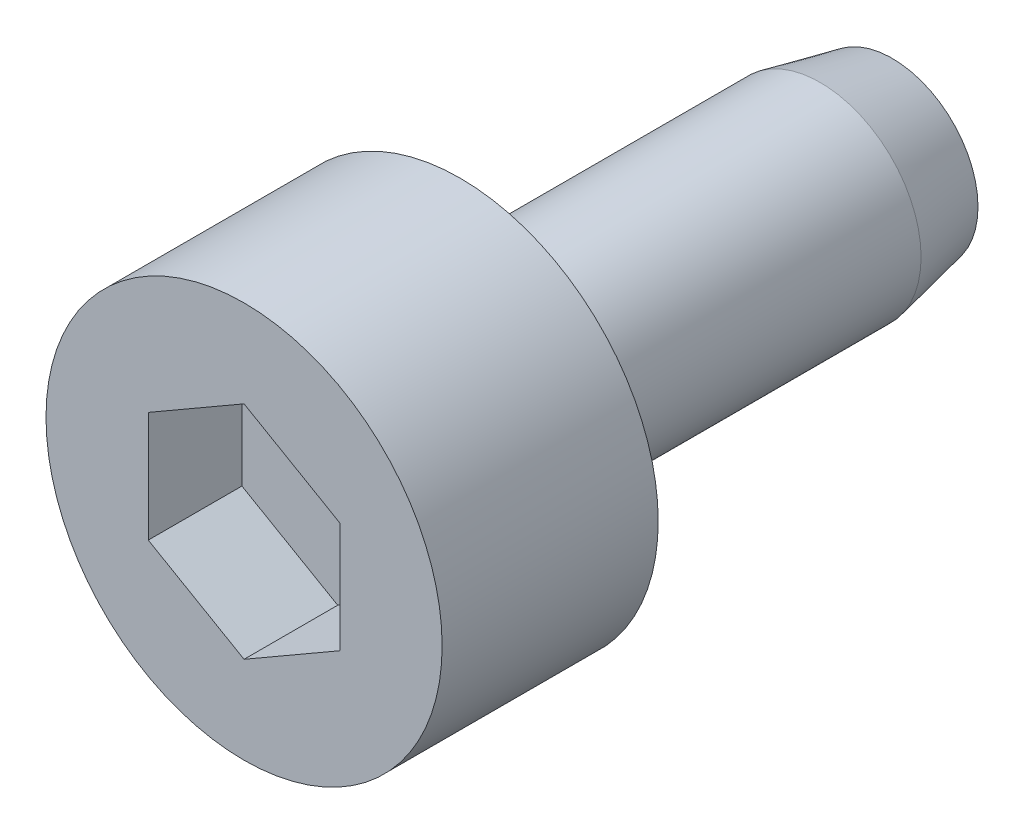
ISO-10303-21;
HEADER;
FILE_DESCRIPTION(('STEP AP214'),'2;1');
FILE_NAME('part.step','',(''),(''),'','','');
FILE_SCHEMA(('AUTOMOTIVE_DESIGN { 1 0 10303 214 1 1 1 1 }'));
ENDSEC;
DATA;
#1=APPLICATION_CONTEXT('core data for automotive mechanical design processes');
#2=APPLICATION_PROTOCOL_DEFINITION('international standard','automotive_design',2000,#1);
#3=PRODUCT_CONTEXT('',#1,'mechanical');
#4=PRODUCT('Part','Part','',(#3));
#5=PRODUCT_RELATED_PRODUCT_CATEGORY('part','',(#4));
#6=PRODUCT_DEFINITION_FORMATION('','',#4);
#7=PRODUCT_DEFINITION_CONTEXT('part definition',#1,'design');
#8=PRODUCT_DEFINITION('design','',#6,#7);
#9=PRODUCT_DEFINITION_SHAPE('','',#8);
#10=(LENGTH_UNIT() NAMED_UNIT(*) SI_UNIT(.MILLI.,.METRE.));
#11=(NAMED_UNIT(*) PLANE_ANGLE_UNIT() SI_UNIT($,.RADIAN.));
#12=(NAMED_UNIT(*) SI_UNIT($,.STERADIAN.) SOLID_ANGLE_UNIT());
#13=UNCERTAINTY_MEASURE_WITH_UNIT(LENGTH_MEASURE(1.E-05),#10,'distance_accuracy_value','');
#14=(GEOMETRIC_REPRESENTATION_CONTEXT(3) GLOBAL_UNCERTAINTY_ASSIGNED_CONTEXT((#13)) GLOBAL_UNIT_ASSIGNED_CONTEXT((#10,
#11,#12)) REPRESENTATION_CONTEXT('',''));
#15=CARTESIAN_POINT('',(0.,0.,0.));
#16=DIRECTION('',(0.,0.,1.));
#17=DIRECTION('',(1.,0.,0.));
#18=AXIS2_PLACEMENT_3D('',#15,#16,#17);
#19=CARTESIAN_POINT('',(0.,0.,-9.));
#20=DIRECTION('',(0.,0.,1.));
#21=DIRECTION('',(1.,0.,0.));
#22=AXIS2_PLACEMENT_3D('',#19,#20,#21);
#23=PLANE('',#22);
#24=CARTESIAN_POINT('',(0.,0.,-9.));
#25=DIRECTION('',(0.,0.,1.));
#26=DIRECTION('',(1.,0.,0.));
#27=AXIS2_PLACEMENT_3D('',#24,#25,#26);
#28=CIRCLE('',#27,1.19);
#29=CARTESIAN_POINT('',(1.19,0.,-9.));
#30=VERTEX_POINT('',#29);
#31=EDGE_CURVE('E10',#30,#30,#28,.T.);
#32=ORIENTED_EDGE('',*,*,#31,.F.);
#33=EDGE_LOOP('',(#32));
#34=FACE_BOUND('',#33,.T.);
#35=ADVANCED_FACE('F16',(#34),#23,.F.);
#36=CARTESIAN_POINT('',(0.,0.,-8.));
#37=DIRECTION('',(0.,0.,1.));
#38=DIRECTION('',(1.,0.,0.));
#39=AXIS2_PLACEMENT_3D('',#36,#37,#38);
#40=CONICAL_SURFACE('',#39,1.4,0.20699219422);
#41=DIRECTION('',(-0.205517234286012,0.,-0.978653496602055));
#42=VECTOR('',#41,1.);
#43=CARTESIAN_POINT('',(1.4,0.,-8.));
#44=LINE('',#43,#42);
#45=CARTESIAN_POINT('',(1.4,0.,-8.));
#46=VERTEX_POINT('',#45);
#47=EDGE_CURVE('E24',#46,#30,#44,.T.);
#48=ORIENTED_EDGE('',*,*,#47,.T.);
#49=ORIENTED_EDGE('',*,*,#31,.T.);
#50=ORIENTED_EDGE('',*,*,#47,.F.);
#51=CARTESIAN_POINT('',(0.,0.,-8.));
#52=DIRECTION('',(0.,0.,1.));
#53=DIRECTION('',(1.,0.,0.));
#54=AXIS2_PLACEMENT_3D('',#51,#52,#53);
#55=CIRCLE('',#54,1.4);
#56=EDGE_CURVE('E114',#46,#46,#55,.T.);
#57=ORIENTED_EDGE('',*,*,#56,.F.);
#58=EDGE_LOOP('',(#48,#49,#50,#57));
#59=FACE_BOUND('',#58,.T.);
#60=ADVANCED_FACE('F249',(#59),#40,.T.);
#61=CARTESIAN_POINT('',(0.,0.,-1.3));
#62=DIRECTION('',(0.,0.,1.));
#63=DIRECTION('',(1.,0.,0.));
#64=AXIS2_PLACEMENT_3D('',#61,#62,#63);
#65=PLANE('',#64);
#66=DIRECTION('',(-0.866025403784329,0.50000000000019,0.));
#67=VECTOR('',#66,1.);
#68=CARTESIAN_POINT('',(1.33,0.767875858022,-1.3));
#69=LINE('',#68,#67);
#70=CARTESIAN_POINT('',(1.33,0.767875858022,-1.3));
#71=VERTEX_POINT('',#70);
#72=CARTESIAN_POINT('',(0.,1.535751716044,-1.3));
#73=VERTEX_POINT('',#72);
#74=EDGE_CURVE('E158',#71,#73,#69,.T.);
#75=ORIENTED_EDGE('',*,*,#74,.T.);
#76=DIRECTION('',(-0.866025403784329,-0.50000000000019,0.));
#77=VECTOR('',#76,1.);
#78=CARTESIAN_POINT('',(0.,1.535751716044,-1.3));
#79=LINE('',#78,#77);
#80=CARTESIAN_POINT('',(-1.33,0.767875858022,-1.3));
#81=VERTEX_POINT('',#80);
#82=EDGE_CURVE('E136',#73,#81,#79,.T.);
#83=ORIENTED_EDGE('',*,*,#82,.T.);
#84=DIRECTION('',(0.,-1.,0.));
#85=VECTOR('',#84,1.);
#86=CARTESIAN_POINT('',(-1.33,0.767875858022,-1.3));
#87=LINE('',#86,#85);
#88=CARTESIAN_POINT('',(-1.33,-0.767875858022,-1.3));
#89=VERTEX_POINT('',#88);
#90=EDGE_CURVE('E89',#81,#89,#87,.T.);
#91=ORIENTED_EDGE('',*,*,#90,.T.);
#92=DIRECTION('',(0.866025403784329,-0.50000000000019,0.));
#93=VECTOR('',#92,1.);
#94=CARTESIAN_POINT('',(-1.33,-0.767875858022,-1.3));
#95=LINE('',#94,#93);
#96=CARTESIAN_POINT('',(0.,-1.535751716044,-1.3));
#97=VERTEX_POINT('',#96);
#98=EDGE_CURVE('E84',#89,#97,#95,.T.);
#99=ORIENTED_EDGE('',*,*,#98,.T.);
#100=DIRECTION('',(0.866025403784329,0.50000000000019,0.));
#101=VECTOR('',#100,1.);
#102=CARTESIAN_POINT('',(0.,-1.535751716044,-1.3));
#103=LINE('',#102,#101);
#104=CARTESIAN_POINT('',(1.33,-0.767875858022,-1.3));
#105=VERTEX_POINT('',#104);
#106=EDGE_CURVE('E69',#97,#105,#103,.T.);
#107=ORIENTED_EDGE('',*,*,#106,.T.);
#108=DIRECTION('',(0.,1.,0.));
#109=VECTOR('',#108,1.);
#110=CARTESIAN_POINT('',(1.33,-0.767875858022,-1.3));
#111=LINE('',#110,#109);
#112=EDGE_CURVE('E81',#105,#71,#111,.T.);
#113=ORIENTED_EDGE('',*,*,#112,.T.);
#114=EDGE_LOOP('',(#75,#83,#91,#99,#107,#113));
#115=FACE_BOUND('',#114,.T.);
#116=ADVANCED_FACE('F86',(#115),#65,.T.);
#117=CARTESIAN_POINT('',(0.,0.,-9.));
#118=DIRECTION('',(0.,0.,1.));
#119=DIRECTION('',(1.,0.,0.));
#120=AXIS2_PLACEMENT_3D('',#117,#118,#119);
#121=CYLINDRICAL_SURFACE('',#120,1.4);
#122=DIRECTION('',(0.,0.,1.));
#123=VECTOR('',#122,1.);
#124=CARTESIAN_POINT('',(1.4,0.,-9.));
#125=LINE('',#124,#123);
#126=CARTESIAN_POINT('',(1.4,0.,-3.));
#127=VERTEX_POINT('',#126);
#128=EDGE_CURVE('E111',#46,#127,#125,.T.);
#129=ORIENTED_EDGE('',*,*,#128,.T.);
#130=CARTESIAN_POINT('',(0.,0.,-3.));
#131=DIRECTION('',(0.,0.,1.));
#132=DIRECTION('',(1.,0.,0.));
#133=AXIS2_PLACEMENT_3D('',#130,#131,#132);
#134=CIRCLE('',#133,1.4);
#135=EDGE_CURVE('E157',#127,#127,#134,.T.);
#136=ORIENTED_EDGE('',*,*,#135,.F.);
#137=ORIENTED_EDGE('',*,*,#128,.F.);
#138=ORIENTED_EDGE('',*,*,#56,.T.);
#139=EDGE_LOOP('',(#129,#136,#137,#138));
#140=FACE_BOUND('',#139,.T.);
#141=ADVANCED_FACE('F260',(#140),#121,.T.);
#142=CARTESIAN_POINT('',(1.33,-0.767875858022,0.));
#143=DIRECTION('',(1.,0.,0.));
#144=DIRECTION('',(0.,1.,0.));
#145=AXIS2_PLACEMENT_3D('',#142,#143,#144);
#146=PLANE('',#145);
#147=DIRECTION('',(0.,1.,0.));
#148=VECTOR('',#147,1.);
#149=CARTESIAN_POINT('',(1.33,-0.767875858022,0.));
#150=LINE('',#149,#148);
#151=CARTESIAN_POINT('',(1.33,-0.767875858022,0.));
#152=VERTEX_POINT('',#151);
#153=CARTESIAN_POINT('',(1.33,0.767875858022,0.));
#154=VERTEX_POINT('',#153);
#155=EDGE_CURVE('E143',#152,#154,#150,.T.);
#156=ORIENTED_EDGE('',*,*,#155,.T.);
#157=DIRECTION('',(0.,0.,-1.));
#158=VECTOR('',#157,1.);
#159=CARTESIAN_POINT('',(1.33,0.767875858022,0.));
#160=LINE('',#159,#158);
#161=EDGE_CURVE('E160',#154,#71,#160,.T.);
#162=ORIENTED_EDGE('',*,*,#161,.T.);
#163=ORIENTED_EDGE('',*,*,#112,.F.);
#164=DIRECTION('',(0.,0.,-1.));
#165=VECTOR('',#164,1.);
#166=CARTESIAN_POINT('',(1.33,-0.767875858022,0.));
#167=LINE('',#166,#165);
#168=EDGE_CURVE('E78',#152,#105,#167,.T.);
#169=ORIENTED_EDGE('',*,*,#168,.F.);
#170=EDGE_LOOP('',(#156,#162,#163,#169));
#171=FACE_BOUND('',#170,.T.);
#172=ADVANCED_FACE('F214',(#171),#146,.F.);
#173=CARTESIAN_POINT('',(0.,-1.535751716044,0.));
#174=DIRECTION('',(0.50000000000019,-0.866025403784329,0.));
#175=DIRECTION('',(0.,0.,-1.));
#176=AXIS2_PLACEMENT_3D('',#173,#174,#175);
#177=PLANE('',#176);
#178=DIRECTION('',(0.866025403784329,0.50000000000019,0.));
#179=VECTOR('',#178,1.);
#180=CARTESIAN_POINT('',(0.,-1.535751716044,0.));
#181=LINE('',#180,#179);
#182=CARTESIAN_POINT('',(0.,-1.535751716044,0.));
#183=VERTEX_POINT('',#182);
#184=EDGE_CURVE('E144',#183,#152,#181,.T.);
#185=ORIENTED_EDGE('',*,*,#184,.T.);
#186=ORIENTED_EDGE('',*,*,#168,.T.);
#187=ORIENTED_EDGE('',*,*,#106,.F.);
#188=DIRECTION('',(0.,0.,-1.));
#189=VECTOR('',#188,1.);
#190=CARTESIAN_POINT('',(0.,-1.535751716044,0.));
#191=LINE('',#190,#189);
#192=EDGE_CURVE('E75',#183,#97,#191,.T.);
#193=ORIENTED_EDGE('',*,*,#192,.F.);
#194=EDGE_LOOP('',(#185,#186,#187,#193));
#195=FACE_BOUND('',#194,.T.);
#196=ADVANCED_FACE('F72',(#195),#177,.F.);
#197=CARTESIAN_POINT('',(-1.33,-0.767875858022,0.));
#198=DIRECTION('',(-0.50000000000019,-0.866025403784329,0.));
#199=DIRECTION('',(-0.866025403784329,0.50000000000019,0.));
#200=AXIS2_PLACEMENT_3D('',#197,#198,#199);
#201=PLANE('',#200);
#202=DIRECTION('',(0.866025403784329,-0.50000000000019,0.));
#203=VECTOR('',#202,1.);
#204=CARTESIAN_POINT('',(-1.33,-0.767875858022,0.));
#205=LINE('',#204,#203);
#206=CARTESIAN_POINT('',(-1.33,-0.767875858022,0.));
#207=VERTEX_POINT('',#206);
#208=EDGE_CURVE('E97',#207,#183,#205,.T.);
#209=ORIENTED_EDGE('',*,*,#208,.T.);
#210=ORIENTED_EDGE('',*,*,#192,.T.);
#211=ORIENTED_EDGE('',*,*,#98,.F.);
#212=DIRECTION('',(0.,0.,-1.));
#213=VECTOR('',#212,1.);
#214=CARTESIAN_POINT('',(-1.33,-0.767875858022,0.));
#215=LINE('',#214,#213);
#216=EDGE_CURVE('E104',#207,#89,#215,.T.);
#217=ORIENTED_EDGE('',*,*,#216,.F.);
#218=EDGE_LOOP('',(#209,#210,#211,#217));
#219=FACE_BOUND('',#218,.T.);
#220=ADVANCED_FACE('F95',(#219),#201,.F.);
#221=CARTESIAN_POINT('',(-1.33,0.767875858022,0.));
#222=DIRECTION('',(-1.,0.,0.));
#223=DIRECTION('',(0.,0.,1.));
#224=AXIS2_PLACEMENT_3D('',#221,#222,#223);
#225=PLANE('',#224);
#226=DIRECTION('',(0.,-1.,0.));
#227=VECTOR('',#226,1.);
#228=CARTESIAN_POINT('',(-1.33,0.767875858022,0.));
#229=LINE('',#228,#227);
#230=CARTESIAN_POINT('',(-1.33,0.767875858022,0.));
#231=VERTEX_POINT('',#230);
#232=EDGE_CURVE('E149',#231,#207,#229,.T.);
#233=ORIENTED_EDGE('',*,*,#232,.T.);
#234=ORIENTED_EDGE('',*,*,#216,.T.);
#235=ORIENTED_EDGE('',*,*,#90,.F.);
#236=DIRECTION('',(0.,0.,-1.));
#237=VECTOR('',#236,1.);
#238=CARTESIAN_POINT('',(-1.33,0.767875858022,0.));
#239=LINE('',#238,#237);
#240=EDGE_CURVE('E139',#231,#81,#239,.T.);
#241=ORIENTED_EDGE('',*,*,#240,.F.);
#242=EDGE_LOOP('',(#233,#234,#235,#241));
#243=FACE_BOUND('',#242,.T.);
#244=ADVANCED_FACE('F177',(#243),#225,.F.);
#245=CARTESIAN_POINT('',(0.,1.535751716044,0.));
#246=DIRECTION('',(-0.50000000000019,0.866025403784329,0.));
#247=DIRECTION('',(0.,0.,1.));
#248=AXIS2_PLACEMENT_3D('',#245,#246,#247);
#249=PLANE('',#248);
#250=DIRECTION('',(-0.866025403784329,-0.50000000000019,0.));
#251=VECTOR('',#250,1.);
#252=CARTESIAN_POINT('',(0.,1.535751716044,0.));
#253=LINE('',#252,#251);
#254=CARTESIAN_POINT('',(0.,1.535751716044,0.));
#255=VERTEX_POINT('',#254);
#256=EDGE_CURVE('E153',#255,#231,#253,.T.);
#257=ORIENTED_EDGE('',*,*,#256,.T.);
#258=ORIENTED_EDGE('',*,*,#240,.T.);
#259=ORIENTED_EDGE('',*,*,#82,.F.);
#260=DIRECTION('',(0.,0.,-1.));
#261=VECTOR('',#260,1.);
#262=CARTESIAN_POINT('',(0.,1.535751716044,0.));
#263=LINE('',#262,#261);
#264=EDGE_CURVE('E161',#255,#73,#263,.T.);
#265=ORIENTED_EDGE('',*,*,#264,.F.);
#266=EDGE_LOOP('',(#257,#258,#259,#265));
#267=FACE_BOUND('',#266,.T.);
#268=ADVANCED_FACE('F243',(#267),#249,.F.);
#269=CARTESIAN_POINT('',(1.33,0.767875858022,0.));
#270=DIRECTION('',(0.50000000000019,0.866025403784329,0.));
#271=DIRECTION('',(0.,0.,-1.));
#272=AXIS2_PLACEMENT_3D('',#269,#270,#271);
#273=PLANE('',#272);
#274=DIRECTION('',(-0.866025403784329,0.50000000000019,0.));
#275=VECTOR('',#274,1.);
#276=CARTESIAN_POINT('',(1.33,0.767875858022,0.));
#277=LINE('',#276,#275);
#278=EDGE_CURVE('E135',#154,#255,#277,.T.);
#279=ORIENTED_EDGE('',*,*,#278,.T.);
#280=ORIENTED_EDGE('',*,*,#264,.T.);
#281=ORIENTED_EDGE('',*,*,#74,.F.);
#282=ORIENTED_EDGE('',*,*,#161,.F.);
#283=EDGE_LOOP('',(#279,#280,#281,#282));
#284=FACE_BOUND('',#283,.T.);
#285=ADVANCED_FACE('F233',(#284),#273,.F.);
#286=CARTESIAN_POINT('',(0.,0.,-3.));
#287=DIRECTION('',(0.,0.,1.));
#288=DIRECTION('',(1.,0.,0.));
#289=AXIS2_PLACEMENT_3D('',#286,#287,#288);
#290=PLANE('',#289);
#291=ORIENTED_EDGE('',*,*,#135,.T.);
#292=EDGE_LOOP('',(#291));
#293=FACE_BOUND('',#292,.T.);
#294=CARTESIAN_POINT('',(0.,0.,-3.));
#295=DIRECTION('',(0.,0.,1.));
#296=DIRECTION('',(1.,0.,0.));
#297=AXIS2_PLACEMENT_3D('',#294,#295,#296);
#298=CIRCLE('',#297,2.75);
#299=CARTESIAN_POINT('',(2.75,0.,-3.));
#300=VERTEX_POINT('',#299);
#301=EDGE_CURVE('E131',#300,#300,#298,.T.);
#302=ORIENTED_EDGE('',*,*,#301,.F.);
#303=EDGE_LOOP('',(#302));
#304=FACE_BOUND('',#303,.T.);
#305=ADVANCED_FACE('F231',(#293,#304),#290,.F.);
#306=CARTESIAN_POINT('',(0.,0.,0.));
#307=DIRECTION('',(0.,0.,1.));
#308=DIRECTION('',(1.,0.,0.));
#309=AXIS2_PLACEMENT_3D('',#306,#307,#308);
#310=PLANE('',#309);
#311=ORIENTED_EDGE('',*,*,#278,.F.);
#312=ORIENTED_EDGE('',*,*,#155,.F.);
#313=ORIENTED_EDGE('',*,*,#184,.F.);
#314=ORIENTED_EDGE('',*,*,#208,.F.);
#315=ORIENTED_EDGE('',*,*,#232,.F.);
#316=ORIENTED_EDGE('',*,*,#256,.F.);
#317=EDGE_LOOP('',(#311,#312,#313,#314,#315,#316));
#318=FACE_BOUND('',#317,.T.);
#319=CARTESIAN_POINT('',(0.,0.,0.));
#320=DIRECTION('',(0.,0.,1.));
#321=DIRECTION('',(1.,0.,0.));
#322=AXIS2_PLACEMENT_3D('',#319,#320,#321);
#323=CIRCLE('',#322,2.75);
#324=CARTESIAN_POINT('',(2.75,0.,0.));
#325=VERTEX_POINT('',#324);
#326=EDGE_CURVE('E126',#325,#325,#323,.T.);
#327=ORIENTED_EDGE('',*,*,#326,.T.);
#328=EDGE_LOOP('',(#327));
#329=FACE_BOUND('',#328,.T.);
#330=ADVANCED_FACE('F218',(#318,#329),#310,.T.);
#331=CARTESIAN_POINT('',(0.,0.,-3.));
#332=DIRECTION('',(0.,0.,1.));
#333=DIRECTION('',(1.,0.,0.));
#334=AXIS2_PLACEMENT_3D('',#331,#332,#333);
#335=CYLINDRICAL_SURFACE('',#334,2.75);
#336=ORIENTED_EDGE('',*,*,#326,.F.);
#337=DIRECTION('',(0.,0.,1.));
#338=VECTOR('',#337,1.);
#339=CARTESIAN_POINT('',(2.75,0.,-3.));
#340=LINE('',#339,#338);
#341=EDGE_CURVE('E128',#300,#325,#340,.T.);
#342=ORIENTED_EDGE('',*,*,#341,.F.);
#343=ORIENTED_EDGE('',*,*,#301,.T.);
#344=ORIENTED_EDGE('',*,*,#341,.T.);
#345=EDGE_LOOP('',(#336,#342,#343,#344));
#346=FACE_BOUND('',#345,.T.);
#347=ADVANCED_FACE('F228',(#346),#335,.T.);
#348=CLOSED_SHELL('',(#35,#60,#116,#141,#172,#196,#220,#244,#268,#285,#305,#330,#347));
#349=MANIFOLD_SOLID_BREP('B1',#348);
#350=ADVANCED_BREP_SHAPE_REPRESENTATION('',(#18,#349),#14);
#351=SHAPE_DEFINITION_REPRESENTATION(#9,#350);
ENDSEC;
END-ISO-10303-21;
